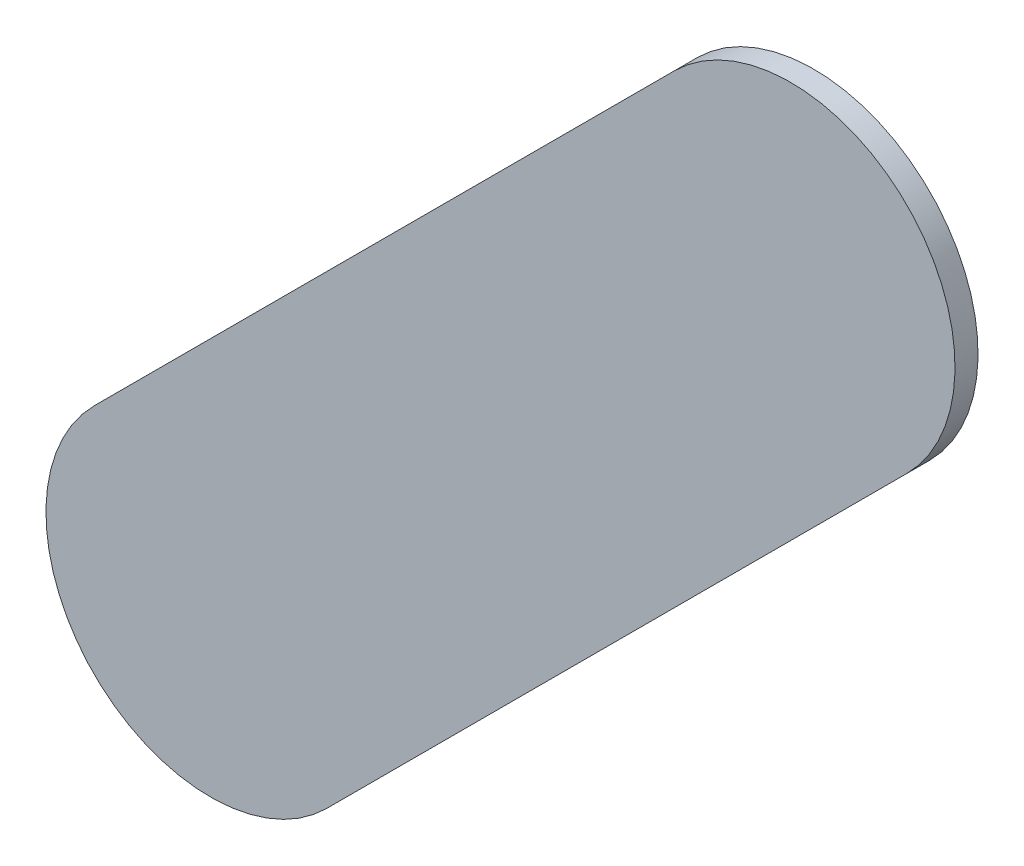
ISO-10303-21;
HEADER;
FILE_DESCRIPTION(('STEP AP214'),'2;1');
FILE_NAME('part.step','',(''),(''),'','','');
FILE_SCHEMA(('AUTOMOTIVE_DESIGN { 1 0 10303 214 1 1 1 1 }'));
ENDSEC;
DATA;
#1=APPLICATION_CONTEXT('core data for automotive mechanical design processes');
#2=APPLICATION_PROTOCOL_DEFINITION('international standard','automotive_design',2000,#1);
#3=PRODUCT_CONTEXT('',#1,'mechanical');
#4=PRODUCT('Part','Part','',(#3));
#5=PRODUCT_RELATED_PRODUCT_CATEGORY('part','',(#4));
#6=PRODUCT_DEFINITION_FORMATION('','',#4);
#7=PRODUCT_DEFINITION_CONTEXT('part definition',#1,'design');
#8=PRODUCT_DEFINITION('design','',#6,#7);
#9=PRODUCT_DEFINITION_SHAPE('','',#8);
#10=(LENGTH_UNIT() NAMED_UNIT(*) SI_UNIT(.MILLI.,.METRE.));
#11=(NAMED_UNIT(*) PLANE_ANGLE_UNIT() SI_UNIT($,.RADIAN.));
#12=(NAMED_UNIT(*) SI_UNIT($,.STERADIAN.) SOLID_ANGLE_UNIT());
#13=UNCERTAINTY_MEASURE_WITH_UNIT(LENGTH_MEASURE(1.E-05),#10,'distance_accuracy_value','');
#14=(GEOMETRIC_REPRESENTATION_CONTEXT(3) GLOBAL_UNCERTAINTY_ASSIGNED_CONTEXT((#13)) GLOBAL_UNIT_ASSIGNED_CONTEXT((#10,
#11,#12)) REPRESENTATION_CONTEXT('',''));
#15=CARTESIAN_POINT('',(0.,0.,0.));
#16=DIRECTION('',(0.,0.,1.));
#17=DIRECTION('',(1.,0.,0.));
#18=AXIS2_PLACEMENT_3D('',#15,#16,#17);
#19=CARTESIAN_POINT('',(76.276776,-112.676776,1.635));
#20=DIRECTION('',(0.,0.,1.));
#21=DIRECTION('',(1.,0.,0.));
#22=AXIS2_PLACEMENT_3D('',#19,#20,#21);
#23=PLANE('',#22);
#24=DIRECTION('',(0.707106781186548,0.707106781186548,0.));
#25=VECTOR('',#24,1.);
#26=CARTESIAN_POINT('',(76.276776,-112.676776,1.635));
#27=LINE('',#26,#25);
#28=CARTESIAN_POINT('',(76.276776,-112.676776,1.635));
#29=VERTEX_POINT('',#28);
#30=CARTESIAN_POINT('',(77.159276,-111.794276,1.635));
#31=VERTEX_POINT('',#30);
#32=EDGE_CURVE('E81',#29,#31,#27,.T.);
#33=ORIENTED_EDGE('',*,*,#32,.T.);
#34=CARTESIAN_POINT('',(76.9824995,-111.6174995,1.635));
#35=DIRECTION('',(0.,0.,1.));
#36=DIRECTION('',(0.707106781186548,-0.707106781186548,0.));
#37=AXIS2_PLACEMENT_3D('',#34,#35,#36);
#38=CIRCLE('',#37,0.249999723809);
#39=CARTESIAN_POINT('',(76.805723,-111.440723,1.635));
#40=VERTEX_POINT('',#39);
#41=EDGE_CURVE('E79',#31,#40,#38,.T.);
#42=ORIENTED_EDGE('',*,*,#41,.T.);
#43=DIRECTION('',(-0.707106781186548,-0.707106781186548,0.));
#44=VECTOR('',#43,1.);
#45=CARTESIAN_POINT('',(76.805723,-111.440723,1.635));
#46=LINE('',#45,#44);
#47=CARTESIAN_POINT('',(75.923223,-112.323223,1.635));
#48=VERTEX_POINT('',#47);
#49=EDGE_CURVE('E68',#40,#48,#46,.T.);
#50=ORIENTED_EDGE('',*,*,#49,.T.);
#51=CARTESIAN_POINT('',(76.0999995,-112.4999995,1.635));
#52=DIRECTION('',(0.,0.,1.));
#53=DIRECTION('',(-0.707106781186548,0.707106781186548,0.));
#54=AXIS2_PLACEMENT_3D('',#51,#52,#53);
#55=CIRCLE('',#54,0.249999723809);
#56=EDGE_CURVE('E11',#48,#29,#55,.T.);
#57=ORIENTED_EDGE('',*,*,#56,.T.);
#58=EDGE_LOOP('',(#33,#42,#50,#57));
#59=FACE_BOUND('',#58,.T.);
#60=ADVANCED_FACE('F17',(#59),#23,.T.);
#61=CARTESIAN_POINT('',(76.276776,-112.676776,1.6));
#62=DIRECTION('',(0.,0.,1.));
#63=DIRECTION('',(1.,0.,0.));
#64=AXIS2_PLACEMENT_3D('',#61,#62,#63);
#65=PLANE('',#64);
#66=CARTESIAN_POINT('',(76.0999995,-112.4999995,1.6));
#67=DIRECTION('',(0.,0.,1.));
#68=DIRECTION('',(-0.707106781186548,0.707106781186548,0.));
#69=AXIS2_PLACEMENT_3D('',#66,#67,#68);
#70=CIRCLE('',#69,0.249999723809);
#71=CARTESIAN_POINT('',(75.923223,-112.323223,1.6));
#72=VERTEX_POINT('',#71);
#73=CARTESIAN_POINT('',(76.276776,-112.676776,1.6));
#74=VERTEX_POINT('',#73);
#75=EDGE_CURVE('E20',#72,#74,#70,.T.);
#76=ORIENTED_EDGE('',*,*,#75,.F.);
#77=DIRECTION('',(-0.707106781186548,-0.707106781186548,0.));
#78=VECTOR('',#77,1.);
#79=CARTESIAN_POINT('',(76.805723,-111.440723,1.6));
#80=LINE('',#79,#78);
#81=CARTESIAN_POINT('',(76.805723,-111.440723,1.6));
#82=VERTEX_POINT('',#81);
#83=EDGE_CURVE('E60',#82,#72,#80,.T.);
#84=ORIENTED_EDGE('',*,*,#83,.F.);
#85=CARTESIAN_POINT('',(76.9824995,-111.6174995,1.6));
#86=DIRECTION('',(0.,0.,1.));
#87=DIRECTION('',(0.707106781186548,-0.707106781186548,0.));
#88=AXIS2_PLACEMENT_3D('',#85,#86,#87);
#89=CIRCLE('',#88,0.249999723809);
#90=CARTESIAN_POINT('',(77.159276,-111.794276,1.6));
#91=VERTEX_POINT('',#90);
#92=EDGE_CURVE('E88',#91,#82,#89,.T.);
#93=ORIENTED_EDGE('',*,*,#92,.F.);
#94=DIRECTION('',(0.707106781186548,0.707106781186548,0.));
#95=VECTOR('',#94,1.);
#96=CARTESIAN_POINT('',(76.276776,-112.676776,1.6));
#97=LINE('',#96,#95);
#98=EDGE_CURVE('E116',#74,#91,#97,.T.);
#99=ORIENTED_EDGE('',*,*,#98,.F.);
#100=EDGE_LOOP('',(#76,#84,#93,#99));
#101=FACE_BOUND('',#100,.T.);
#102=ADVANCED_FACE('F182',(#101),#65,.F.);
#103=CARTESIAN_POINT('',(76.0999995,-112.4999995,1.6));
#104=DIRECTION('',(0.,0.,-1.));
#105=DIRECTION('',(-0.707106781186548,0.707106781186548,0.));
#106=AXIS2_PLACEMENT_3D('',#103,#104,#105);
#107=CYLINDRICAL_SURFACE('',#106,0.249999723809);
#108=ORIENTED_EDGE('',*,*,#75,.T.);
#109=DIRECTION('',(0.,0.,1.));
#110=VECTOR('',#109,1.);
#111=CARTESIAN_POINT('',(76.276776,-112.676776,1.6));
#112=LINE('',#111,#110);
#113=EDGE_CURVE('E95',#74,#29,#112,.T.);
#114=ORIENTED_EDGE('',*,*,#113,.T.);
#115=ORIENTED_EDGE('',*,*,#56,.F.);
#116=DIRECTION('',(0.,0.,1.));
#117=VECTOR('',#116,1.);
#118=CARTESIAN_POINT('',(75.923223,-112.323223,1.6));
#119=LINE('',#118,#117);
#120=EDGE_CURVE('E74',#72,#48,#119,.T.);
#121=ORIENTED_EDGE('',*,*,#120,.F.);
#122=EDGE_LOOP('',(#108,#114,#115,#121));
#123=FACE_BOUND('',#122,.T.);
#124=ADVANCED_FACE('F111',(#123),#107,.T.);
#125=CARTESIAN_POINT('',(76.805723,-111.440723,1.6));
#126=DIRECTION('',(0.707106781186548,-0.707106781186548,0.));
#127=DIRECTION('',(0.,0.,-1.));
#128=AXIS2_PLACEMENT_3D('',#125,#126,#127);
#129=PLANE('',#128);
#130=ORIENTED_EDGE('',*,*,#83,.T.);
#131=ORIENTED_EDGE('',*,*,#120,.T.);
#132=ORIENTED_EDGE('',*,*,#49,.F.);
#133=DIRECTION('',(0.,0.,1.));
#134=VECTOR('',#133,1.);
#135=CARTESIAN_POINT('',(76.805723,-111.440723,1.6));
#136=LINE('',#135,#134);
#137=EDGE_CURVE('E72',#82,#40,#136,.T.);
#138=ORIENTED_EDGE('',*,*,#137,.F.);
#139=EDGE_LOOP('',(#130,#131,#132,#138));
#140=FACE_BOUND('',#139,.T.);
#141=ADVANCED_FACE('F70',(#140),#129,.F.);
#142=CARTESIAN_POINT('',(76.9824995,-111.6174995,1.6));
#143=DIRECTION('',(0.,0.,-1.));
#144=DIRECTION('',(0.707106781186548,-0.707106781186548,0.));
#145=AXIS2_PLACEMENT_3D('',#142,#143,#144);
#146=CYLINDRICAL_SURFACE('',#145,0.249999723809);
#147=ORIENTED_EDGE('',*,*,#92,.T.);
#148=ORIENTED_EDGE('',*,*,#137,.T.);
#149=ORIENTED_EDGE('',*,*,#41,.F.);
#150=DIRECTION('',(0.,0.,1.));
#151=VECTOR('',#150,1.);
#152=CARTESIAN_POINT('',(77.159276,-111.794276,1.6));
#153=LINE('',#152,#151);
#154=EDGE_CURVE('E101',#91,#31,#153,.T.);
#155=ORIENTED_EDGE('',*,*,#154,.F.);
#156=EDGE_LOOP('',(#147,#148,#149,#155));
#157=FACE_BOUND('',#156,.T.);
#158=ADVANCED_FACE('F87',(#157),#146,.T.);
#159=CARTESIAN_POINT('',(76.276776,-112.676776,1.6));
#160=DIRECTION('',(-0.707106781186548,0.707106781186548,0.));
#161=DIRECTION('',(0.,0.,1.));
#162=AXIS2_PLACEMENT_3D('',#159,#160,#161);
#163=PLANE('',#162);
#164=ORIENTED_EDGE('',*,*,#98,.T.);
#165=ORIENTED_EDGE('',*,*,#154,.T.);
#166=ORIENTED_EDGE('',*,*,#32,.F.);
#167=ORIENTED_EDGE('',*,*,#113,.F.);
#168=EDGE_LOOP('',(#164,#165,#166,#167));
#169=FACE_BOUND('',#168,.T.);
#170=ADVANCED_FACE('F115',(#169),#163,.F.);
#171=CLOSED_SHELL('',(#60,#102,#124,#141,#158,#170));
#172=MANIFOLD_SOLID_BREP('B1',#171);
#173=ADVANCED_BREP_SHAPE_REPRESENTATION('',(#18,#172),#14);
#174=SHAPE_DEFINITION_REPRESENTATION(#9,#173);
ENDSEC;
END-ISO-10303-21;
